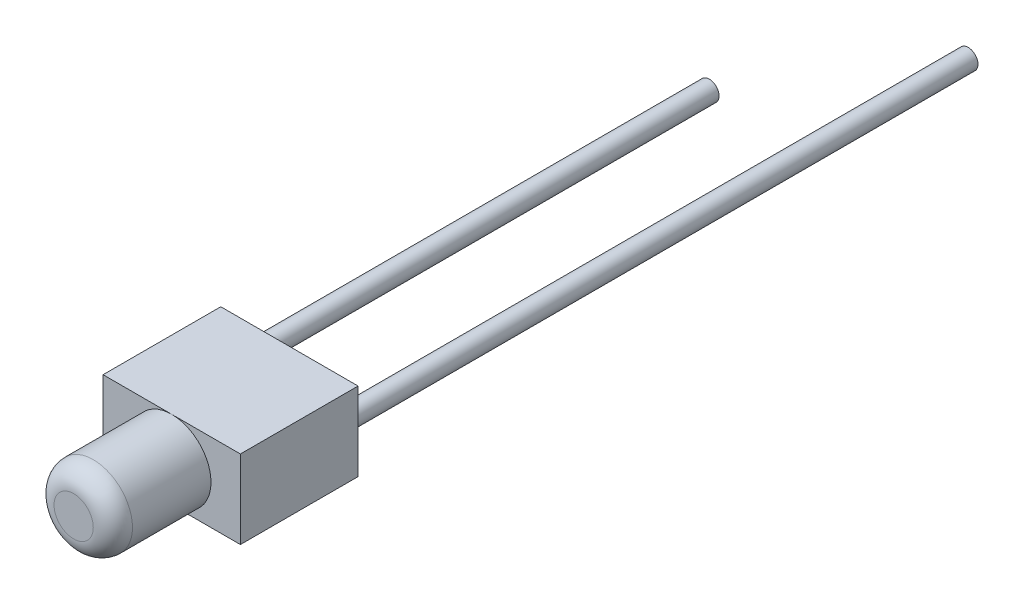
ISO-10303-21;
HEADER;
FILE_DESCRIPTION(('STEP AP214'),'2;1');
FILE_NAME('part.step','',(''),(''),'','','');
FILE_SCHEMA(('AUTOMOTIVE_DESIGN { 1 0 10303 214 1 1 1 1 }'));
ENDSEC;
DATA;
#1=APPLICATION_CONTEXT('core data for automotive mechanical design processes');
#2=APPLICATION_PROTOCOL_DEFINITION('international standard','automotive_design',2000,#1);
#3=PRODUCT_CONTEXT('',#1,'mechanical');
#4=PRODUCT('Part','Part','',(#3));
#5=PRODUCT_RELATED_PRODUCT_CATEGORY('part','',(#4));
#6=PRODUCT_DEFINITION_FORMATION('','',#4);
#7=PRODUCT_DEFINITION_CONTEXT('part definition',#1,'design');
#8=PRODUCT_DEFINITION('design','',#6,#7);
#9=PRODUCT_DEFINITION_SHAPE('','',#8);
#10=(LENGTH_UNIT() NAMED_UNIT(*) SI_UNIT(.MILLI.,.METRE.));
#11=(NAMED_UNIT(*) PLANE_ANGLE_UNIT() SI_UNIT($,.RADIAN.));
#12=(NAMED_UNIT(*) SI_UNIT($,.STERADIAN.) SOLID_ANGLE_UNIT());
#13=UNCERTAINTY_MEASURE_WITH_UNIT(LENGTH_MEASURE(1.E-05),#10,'distance_accuracy_value','');
#14=(GEOMETRIC_REPRESENTATION_CONTEXT(3) GLOBAL_UNCERTAINTY_ASSIGNED_CONTEXT((#13)) GLOBAL_UNIT_ASSIGNED_CONTEXT((#10,
#11,#12)) REPRESENTATION_CONTEXT('',''));
#15=CARTESIAN_POINT('',(0.,0.,0.));
#16=DIRECTION('',(0.,0.,1.));
#17=DIRECTION('',(1.,0.,0.));
#18=AXIS2_PLACEMENT_3D('',#15,#16,#17);
#19=CARTESIAN_POINT('',(0.45,-1.,-16.));
#20=DIRECTION('',(0.,0.,1.));
#21=DIRECTION('',(1.,0.,0.));
#22=AXIS2_PLACEMENT_3D('',#19,#20,#21);
#23=CYLINDRICAL_SURFACE('',#22,0.25);
#24=CARTESIAN_POINT('',(0.45,-1.,0.));
#25=DIRECTION('',(0.,0.,1.));
#26=DIRECTION('',(1.,0.,0.));
#27=AXIS2_PLACEMENT_3D('',#24,#25,#26);
#28=CIRCLE('',#27,0.25);
#29=CARTESIAN_POINT('',(0.7,-1.,0.));
#30=VERTEX_POINT('',#29);
#31=EDGE_CURVE('E12',#30,#30,#28,.F.);
#32=ORIENTED_EDGE('',*,*,#31,.T.);
#33=EDGE_LOOP('',(#32));
#34=FACE_BOUND('',#33,.T.);
#35=CARTESIAN_POINT('',(0.45,-1.,-12.));
#36=DIRECTION('',(0.,0.,-1.));
#37=DIRECTION('',(-1.,0.,0.));
#38=AXIS2_PLACEMENT_3D('',#35,#36,#37);
#39=CIRCLE('',#38,0.25);
#40=CARTESIAN_POINT('',(0.2,-1.,-12.));
#41=VERTEX_POINT('',#40);
#42=EDGE_CURVE('E61',#41,#41,#39,.T.);
#43=ORIENTED_EDGE('',*,*,#42,.F.);
#44=EDGE_LOOP('',(#43));
#45=FACE_BOUND('',#44,.T.);
#46=ADVANCED_FACE('F57',(#34,#45),#23,.T.);
#47=CARTESIAN_POINT('',(0.,-2.,5.5));
#48=DIRECTION('',(0.,1.,0.));
#49=DIRECTION('',(0.,0.,1.));
#50=AXIS2_PLACEMENT_3D('',#47,#48,#49);
#51=PLANE('',#50);
#52=DIRECTION('',(1.,0.,0.));
#53=VECTOR('',#52,1.);
#54=CARTESIAN_POINT('',(0.,-2.,3.));
#55=LINE('',#54,#53);
#56=CARTESIAN_POINT('',(1.75,-2.,3.));
#57=VERTEX_POINT('',#56);
#58=CARTESIAN_POINT('',(3.5,-2.,3.));
#59=VERTEX_POINT('',#58);
#60=EDGE_CURVE('E110',#57,#59,#55,.T.);
#61=ORIENTED_EDGE('',*,*,#60,.F.);
#62=DIRECTION('',(1.,0.,0.));
#63=VECTOR('',#62,1.);
#64=CARTESIAN_POINT('',(0.,-2.,3.));
#65=LINE('',#64,#63);
#66=CARTESIAN_POINT('',(0.,-2.,3.));
#67=VERTEX_POINT('',#66);
#68=EDGE_CURVE('E123',#67,#57,#65,.T.);
#69=ORIENTED_EDGE('',*,*,#68,.F.);
#70=DIRECTION('',(0.,0.,-1.));
#71=VECTOR('',#70,1.);
#72=CARTESIAN_POINT('',(0.,-2.,5.5));
#73=LINE('',#72,#71);
#74=CARTESIAN_POINT('',(0.,-2.,0.));
#75=VERTEX_POINT('',#74);
#76=EDGE_CURVE('E152',#67,#75,#73,.T.);
#77=ORIENTED_EDGE('',*,*,#76,.T.);
#78=DIRECTION('',(1.,0.,0.));
#79=VECTOR('',#78,1.);
#80=CARTESIAN_POINT('',(0.,-2.,0.));
#81=LINE('',#80,#79);
#82=CARTESIAN_POINT('',(3.5,-2.,0.));
#83=VERTEX_POINT('',#82);
#84=EDGE_CURVE('E139',#75,#83,#81,.T.);
#85=ORIENTED_EDGE('',*,*,#84,.T.);
#86=DIRECTION('',(0.,0.,-1.));
#87=VECTOR('',#86,1.);
#88=CARTESIAN_POINT('',(3.5,-2.,5.5));
#89=LINE('',#88,#87);
#90=EDGE_CURVE('E126',#59,#83,#89,.T.);
#91=ORIENTED_EDGE('',*,*,#90,.F.);
#92=EDGE_LOOP('',(#61,#69,#77,#85,#91));
#93=FACE_BOUND('',#92,.T.);
#94=ADVANCED_FACE('F121',(#93),#51,.F.);
#95=CARTESIAN_POINT('',(0.,0.,5.5));
#96=DIRECTION('',(0.,0.,1.));
#97=DIRECTION('',(1.,0.,0.));
#98=AXIS2_PLACEMENT_3D('',#95,#96,#97);
#99=PLANE('',#98);
#100=CARTESIAN_POINT('',(1.75,-1.,5.5));
#101=DIRECTION('',(0.,0.,1.));
#102=DIRECTION('',(1.,0.,0.));
#103=AXIS2_PLACEMENT_3D('',#100,#101,#102);
#104=CIRCLE('',#103,0.5);
#105=CARTESIAN_POINT('',(2.25,-1.,5.5));
#106=VERTEX_POINT('',#105);
#107=EDGE_CURVE('E154',#106,#106,#104,.T.);
#108=ORIENTED_EDGE('',*,*,#107,.T.);
#109=EDGE_LOOP('',(#108));
#110=FACE_BOUND('',#109,.T.);
#111=ADVANCED_FACE('F186',(#110),#99,.T.);
#112=CARTESIAN_POINT('',(3.5,0.,5.5));
#113=DIRECTION('',(-1.,0.,0.));
#114=DIRECTION('',(0.,0.,1.));
#115=AXIS2_PLACEMENT_3D('',#112,#113,#114);
#116=PLANE('',#115);
#117=DIRECTION('',(0.,1.,0.));
#118=VECTOR('',#117,1.);
#119=CARTESIAN_POINT('',(3.5,0.,3.));
#120=LINE('',#119,#118);
#121=CARTESIAN_POINT('',(3.5,0.,3.));
#122=VERTEX_POINT('',#121);
#123=EDGE_CURVE('E127',#59,#122,#120,.T.);
#124=ORIENTED_EDGE('',*,*,#123,.F.);
#125=ORIENTED_EDGE('',*,*,#90,.T.);
#126=DIRECTION('',(0.,1.,0.));
#127=VECTOR('',#126,1.);
#128=CARTESIAN_POINT('',(3.5,0.,0.));
#129=LINE('',#128,#127);
#130=CARTESIAN_POINT('',(3.5,0.,0.));
#131=VERTEX_POINT('',#130);
#132=EDGE_CURVE('E145',#83,#131,#129,.T.);
#133=ORIENTED_EDGE('',*,*,#132,.T.);
#134=DIRECTION('',(0.,0.,-1.));
#135=VECTOR('',#134,1.);
#136=CARTESIAN_POINT('',(3.5,0.,5.5));
#137=LINE('',#136,#135);
#138=EDGE_CURVE('E80',#122,#131,#137,.T.);
#139=ORIENTED_EDGE('',*,*,#138,.F.);
#140=EDGE_LOOP('',(#124,#125,#133,#139));
#141=FACE_BOUND('',#140,.T.);
#142=ADVANCED_FACE('F176',(#141),#116,.F.);
#143=CARTESIAN_POINT('',(0.,0.,5.5));
#144=DIRECTION('',(0.,-1.,0.));
#145=DIRECTION('',(0.,0.,-1.));
#146=AXIS2_PLACEMENT_3D('',#143,#144,#145);
#147=PLANE('',#146);
#148=DIRECTION('',(-1.,0.,0.));
#149=VECTOR('',#148,1.);
#150=CARTESIAN_POINT('',(0.,0.,3.));
#151=LINE('',#150,#149);
#152=CARTESIAN_POINT('',(1.75,0.,3.));
#153=VERTEX_POINT('',#152);
#154=EDGE_CURVE('E112',#122,#153,#151,.T.);
#155=ORIENTED_EDGE('',*,*,#154,.F.);
#156=ORIENTED_EDGE('',*,*,#138,.T.);
#157=DIRECTION('',(-1.,0.,0.));
#158=VECTOR('',#157,1.);
#159=CARTESIAN_POINT('',(0.,0.,0.));
#160=LINE('',#159,#158);
#161=CARTESIAN_POINT('',(0.,0.,0.));
#162=VERTEX_POINT('',#161);
#163=EDGE_CURVE('E147',#131,#162,#160,.T.);
#164=ORIENTED_EDGE('',*,*,#163,.T.);
#165=DIRECTION('',(0.,0.,-1.));
#166=VECTOR('',#165,1.);
#167=CARTESIAN_POINT('',(0.,0.,5.5));
#168=LINE('',#167,#166);
#169=CARTESIAN_POINT('',(0.,0.,3.));
#170=VERTEX_POINT('',#169);
#171=EDGE_CURVE('E73',#170,#162,#168,.T.);
#172=ORIENTED_EDGE('',*,*,#171,.F.);
#173=DIRECTION('',(-1.,0.,0.));
#174=VECTOR('',#173,1.);
#175=CARTESIAN_POINT('',(0.,0.,3.));
#176=LINE('',#175,#174);
#177=EDGE_CURVE('E133',#153,#170,#176,.T.);
#178=ORIENTED_EDGE('',*,*,#177,.F.);
#179=EDGE_LOOP('',(#155,#156,#164,#172,#178));
#180=FACE_BOUND('',#179,.T.);
#181=ADVANCED_FACE('F179',(#180),#147,.F.);
#182=CARTESIAN_POINT('',(0.,0.,5.5));
#183=DIRECTION('',(1.,0.,0.));
#184=DIRECTION('',(0.,0.,-1.));
#185=AXIS2_PLACEMENT_3D('',#182,#183,#184);
#186=PLANE('',#185);
#187=DIRECTION('',(0.,-1.,0.));
#188=VECTOR('',#187,1.);
#189=CARTESIAN_POINT('',(0.,0.,3.));
#190=LINE('',#189,#188);
#191=EDGE_CURVE('E136',#170,#67,#190,.T.);
#192=ORIENTED_EDGE('',*,*,#191,.F.);
#193=ORIENTED_EDGE('',*,*,#171,.T.);
#194=DIRECTION('',(0.,-1.,0.));
#195=VECTOR('',#194,1.);
#196=CARTESIAN_POINT('',(0.,0.,0.));
#197=LINE('',#196,#195);
#198=EDGE_CURVE('E137',#162,#75,#197,.T.);
#199=ORIENTED_EDGE('',*,*,#198,.T.);
#200=ORIENTED_EDGE('',*,*,#76,.F.);
#201=EDGE_LOOP('',(#192,#193,#199,#200));
#202=FACE_BOUND('',#201,.T.);
#203=ADVANCED_FACE('F168',(#202),#186,.F.);
#204=CARTESIAN_POINT('',(0.,0.,0.));
#205=DIRECTION('',(0.,0.,1.));
#206=DIRECTION('',(1.,0.,0.));
#207=AXIS2_PLACEMENT_3D('',#204,#205,#206);
#208=PLANE('',#207);
#209=ORIENTED_EDGE('',*,*,#31,.F.);
#210=EDGE_LOOP('',(#209));
#211=FACE_BOUND('',#210,.T.);
#212=CARTESIAN_POINT('',(3.05,-1.,0.));
#213=DIRECTION('',(0.,0.,1.));
#214=DIRECTION('',(1.,0.,0.));
#215=AXIS2_PLACEMENT_3D('',#212,#213,#214);
#216=CIRCLE('',#215,0.25);
#217=CARTESIAN_POINT('',(3.3,-1.,0.));
#218=VERTEX_POINT('',#217);
#219=EDGE_CURVE('E66',#218,#218,#216,.F.);
#220=ORIENTED_EDGE('',*,*,#219,.F.);
#221=EDGE_LOOP('',(#220));
#222=FACE_BOUND('',#221,.T.);
#223=ORIENTED_EDGE('',*,*,#198,.F.);
#224=ORIENTED_EDGE('',*,*,#163,.F.);
#225=ORIENTED_EDGE('',*,*,#132,.F.);
#226=ORIENTED_EDGE('',*,*,#84,.F.);
#227=EDGE_LOOP('',(#223,#224,#225,#226));
#228=FACE_BOUND('',#227,.T.);
#229=ADVANCED_FACE('F165',(#211,#222,#228),#208,.F.);
#230=CARTESIAN_POINT('',(1.75,-1.,3.));
#231=DIRECTION('',(0.,0.,1.));
#232=DIRECTION('',(1.,0.,0.));
#233=AXIS2_PLACEMENT_3D('',#230,#231,#232);
#234=CYLINDRICAL_SURFACE('',#233,1.);
#235=CARTESIAN_POINT('',(1.75,-1.,5.));
#236=DIRECTION('',(0.,0.,1.));
#237=DIRECTION('',(1.,0.,0.));
#238=AXIS2_PLACEMENT_3D('',#235,#236,#237);
#239=CIRCLE('',#238,1.);
#240=CARTESIAN_POINT('',(2.75,-1.,5.));
#241=VERTEX_POINT('',#240);
#242=EDGE_CURVE('E157',#241,#241,#239,.F.);
#243=ORIENTED_EDGE('',*,*,#242,.T.);
#244=EDGE_LOOP('',(#243));
#245=FACE_BOUND('',#244,.T.);
#246=CARTESIAN_POINT('',(1.75,-1.,3.));
#247=DIRECTION('',(0.,0.,1.));
#248=DIRECTION('',(1.,0.,0.));
#249=AXIS2_PLACEMENT_3D('',#246,#247,#248);
#250=CIRCLE('',#249,1.);
#251=EDGE_CURVE('E107',#57,#153,#250,.T.);
#252=ORIENTED_EDGE('',*,*,#251,.T.);
#253=CARTESIAN_POINT('',(1.75,-1.,3.));
#254=DIRECTION('',(0.,0.,1.));
#255=DIRECTION('',(1.,0.,0.));
#256=AXIS2_PLACEMENT_3D('',#253,#254,#255);
#257=CIRCLE('',#256,1.);
#258=EDGE_CURVE('E129',#153,#57,#257,.T.);
#259=ORIENTED_EDGE('',*,*,#258,.T.);
#260=EDGE_LOOP('',(#252,#259));
#261=FACE_BOUND('',#260,.T.);
#262=ADVANCED_FACE('F130',(#245,#261),#234,.T.);
#263=CARTESIAN_POINT('',(0.,0.,3.));
#264=DIRECTION('',(0.,0.,1.));
#265=DIRECTION('',(1.,0.,0.));
#266=AXIS2_PLACEMENT_3D('',#263,#264,#265);
#267=PLANE('',#266);
#268=ORIENTED_EDGE('',*,*,#258,.F.);
#269=ORIENTED_EDGE('',*,*,#177,.T.);
#270=ORIENTED_EDGE('',*,*,#191,.T.);
#271=ORIENTED_EDGE('',*,*,#68,.T.);
#272=EDGE_LOOP('',(#268,#269,#270,#271));
#273=FACE_BOUND('',#272,.T.);
#274=ADVANCED_FACE('F135',(#273),#267,.T.);
#275=CARTESIAN_POINT('',(0.,0.,3.));
#276=DIRECTION('',(0.,0.,1.));
#277=DIRECTION('',(1.,0.,0.));
#278=AXIS2_PLACEMENT_3D('',#275,#276,#277);
#279=PLANE('',#278);
#280=ORIENTED_EDGE('',*,*,#251,.F.);
#281=ORIENTED_EDGE('',*,*,#60,.T.);
#282=ORIENTED_EDGE('',*,*,#123,.T.);
#283=ORIENTED_EDGE('',*,*,#154,.T.);
#284=EDGE_LOOP('',(#280,#281,#282,#283));
#285=FACE_BOUND('',#284,.T.);
#286=ADVANCED_FACE('F109',(#285),#279,.T.);
#287=CARTESIAN_POINT('',(1.75,-1.,5.));
#288=DIRECTION('',(0.,0.,1.));
#289=DIRECTION('',(1.,0.,0.));
#290=AXIS2_PLACEMENT_3D('',#287,#288,#289);
#291=TOROIDAL_SURFACE('',#290,0.5,0.5);
#292=ORIENTED_EDGE('',*,*,#242,.F.);
#293=EDGE_LOOP('',(#292));
#294=FACE_BOUND('',#293,.T.);
#295=ORIENTED_EDGE('',*,*,#107,.F.);
#296=EDGE_LOOP('',(#295));
#297=FACE_BOUND('',#296,.T.);
#298=ADVANCED_FACE('F59',(#294,#297),#291,.T.);
#299=CARTESIAN_POINT('',(3.05,-1.,-16.));
#300=DIRECTION('',(0.,0.,1.));
#301=DIRECTION('',(1.,0.,0.));
#302=AXIS2_PLACEMENT_3D('',#299,#300,#301);
#303=CYLINDRICAL_SURFACE('',#302,0.25);
#304=CARTESIAN_POINT('',(3.05,-1.,-16.));
#305=DIRECTION('',(0.,0.,-1.));
#306=DIRECTION('',(-1.,0.,0.));
#307=AXIS2_PLACEMENT_3D('',#304,#305,#306);
#308=CIRCLE('',#307,0.25);
#309=CARTESIAN_POINT('',(2.8,-1.,-16.));
#310=VERTEX_POINT('',#309);
#311=EDGE_CURVE('E116',#310,#310,#308,.T.);
#312=ORIENTED_EDGE('',*,*,#311,.F.);
#313=EDGE_LOOP('',(#312));
#314=FACE_BOUND('',#313,.T.);
#315=ORIENTED_EDGE('',*,*,#219,.T.);
#316=EDGE_LOOP('',(#315));
#317=FACE_BOUND('',#316,.T.);
#318=ADVANCED_FACE('F163',(#314,#317),#303,.T.);
#319=CARTESIAN_POINT('',(3.05,-1.,-16.));
#320=DIRECTION('',(0.,0.,-1.));
#321=DIRECTION('',(-1.,0.,0.));
#322=AXIS2_PLACEMENT_3D('',#319,#320,#321);
#323=PLANE('',#322);
#324=ORIENTED_EDGE('',*,*,#311,.T.);
#325=EDGE_LOOP('',(#324));
#326=FACE_BOUND('',#325,.T.);
#327=ADVANCED_FACE('F199',(#326),#323,.T.);
#328=CARTESIAN_POINT('',(0.45,-1.,-12.));
#329=DIRECTION('',(0.,0.,-1.));
#330=DIRECTION('',(-1.,0.,0.));
#331=AXIS2_PLACEMENT_3D('',#328,#329,#330);
#332=PLANE('',#331);
#333=ORIENTED_EDGE('',*,*,#42,.T.);
#334=EDGE_LOOP('',(#333));
#335=FACE_BOUND('',#334,.T.);
#336=ADVANCED_FACE('F198',(#335),#332,.T.);
#337=CLOSED_SHELL('',(#46,#94,#111,#142,#181,#203,#229,#262,#274,#286,#298,#318,#327,#336));
#338=MANIFOLD_SOLID_BREP('B2',#337);
#339=ADVANCED_BREP_SHAPE_REPRESENTATION('',(#18,#338),#14);
#340=SHAPE_DEFINITION_REPRESENTATION(#9,#339);
ENDSEC;
END-ISO-10303-21;
